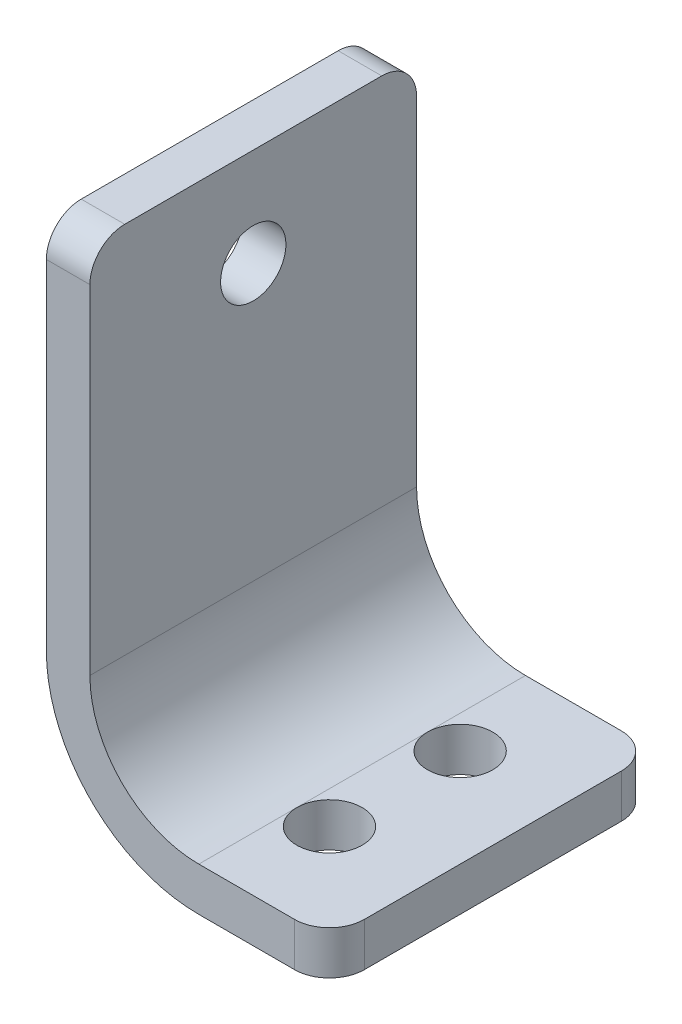
ISO-10303-21;
HEADER;
FILE_DESCRIPTION(('STEP AP214'),'2;1');
FILE_NAME('part.step','',(''),(''),'','','');
FILE_SCHEMA(('AUTOMOTIVE_DESIGN { 1 0 10303 214 1 1 1 1 }'));
ENDSEC;
DATA;
#1=APPLICATION_CONTEXT('core data for automotive mechanical design processes');
#2=APPLICATION_PROTOCOL_DEFINITION('international standard','automotive_design',2000,#1);
#3=PRODUCT_CONTEXT('',#1,'mechanical');
#4=PRODUCT('Part','Part','',(#3));
#5=PRODUCT_RELATED_PRODUCT_CATEGORY('part','',(#4));
#6=PRODUCT_DEFINITION_FORMATION('','',#4);
#7=PRODUCT_DEFINITION_CONTEXT('part definition',#1,'design');
#8=PRODUCT_DEFINITION('design','',#6,#7);
#9=PRODUCT_DEFINITION_SHAPE('','',#8);
#10=(LENGTH_UNIT() NAMED_UNIT(*) SI_UNIT(.MILLI.,.METRE.));
#11=(NAMED_UNIT(*) PLANE_ANGLE_UNIT() SI_UNIT($,.RADIAN.));
#12=(NAMED_UNIT(*) SI_UNIT($,.STERADIAN.) SOLID_ANGLE_UNIT());
#13=UNCERTAINTY_MEASURE_WITH_UNIT(LENGTH_MEASURE(1.E-05),#10,'distance_accuracy_value','');
#14=(GEOMETRIC_REPRESENTATION_CONTEXT(3) GLOBAL_UNCERTAINTY_ASSIGNED_CONTEXT((#13)) GLOBAL_UNIT_ASSIGNED_CONTEXT((#10,
#11,#12)) REPRESENTATION_CONTEXT('',''));
#15=CARTESIAN_POINT('',(0.,0.,0.));
#16=DIRECTION('',(0.,0.,1.));
#17=DIRECTION('',(1.,0.,0.));
#18=AXIS2_PLACEMENT_3D('',#15,#16,#17);
#19=CARTESIAN_POINT('',(0.,19.9954941702119,23.8125));
#20=DIRECTION('',(0.,-1.,0.));
#21=DIRECTION('',(0.,0.,-1.));
#22=AXIS2_PLACEMENT_3D('',#19,#20,#21);
#23=PLANE('',#22);
#24=DIRECTION('',(0.,0.,-1.));
#25=VECTOR('',#24,1.);
#26=CARTESIAN_POINT('',(0.,19.9954941702119,23.8125));
#27=LINE('',#26,#25);
#28=CARTESIAN_POINT('',(0.,19.9954941702119,21.2725));
#29=VERTEX_POINT('',#28);
#30=CARTESIAN_POINT('',(0.,19.9954941702119,2.54));
#31=VERTEX_POINT('',#30);
#32=EDGE_CURVE('E188',#29,#31,#27,.T.);
#33=ORIENTED_EDGE('',*,*,#32,.T.);
#34=DIRECTION('',(-1.,0.,0.));
#35=VECTOR('',#34,1.);
#36=CARTESIAN_POINT('',(-3.175,19.9954941702119,2.54));
#37=LINE('',#36,#35);
#38=CARTESIAN_POINT('',(-3.175,19.9954941702119,2.54));
#39=VERTEX_POINT('',#38);
#40=EDGE_CURVE('E266',#31,#39,#37,.T.);
#41=ORIENTED_EDGE('',*,*,#40,.T.);
#42=DIRECTION('',(0.,0.,-1.));
#43=VECTOR('',#42,1.);
#44=CARTESIAN_POINT('',(-3.175,19.9954941702119,23.8125));
#45=LINE('',#44,#43);
#46=CARTESIAN_POINT('',(-3.175,19.9954941702119,21.2725));
#47=VERTEX_POINT('',#46);
#48=EDGE_CURVE('E165',#47,#39,#45,.T.);
#49=ORIENTED_EDGE('',*,*,#48,.F.);
#50=DIRECTION('',(-1.,0.,0.));
#51=VECTOR('',#50,1.);
#52=CARTESIAN_POINT('',(0.,19.9954941702119,21.2725));
#53=LINE('',#52,#51);
#54=EDGE_CURVE('E60',#47,#29,#53,.F.);
#55=ORIENTED_EDGE('',*,*,#54,.T.);
#56=EDGE_LOOP('',(#33,#41,#49,#55));
#57=FACE_BOUND('',#56,.T.);
#58=ADVANCED_FACE('F39',(#57),#23,.F.);
#59=CARTESIAN_POINT('',(-3.175,19.9954941702119,23.8125));
#60=DIRECTION('',(1.,0.,0.));
#61=DIRECTION('',(0.,1.,0.));
#62=AXIS2_PLACEMENT_3D('',#59,#60,#61);
#63=PLANE('',#62);
#64=CARTESIAN_POINT('',(-3.175,12.8517441702119,11.90625));
#65=DIRECTION('',(1.,0.,0.));
#66=DIRECTION('',(0.,1.,0.));
#67=AXIS2_PLACEMENT_3D('',#64,#65,#66);
#68=CIRCLE('',#67,2.38125);
#69=CARTESIAN_POINT('',(-3.175,15.232994170212,11.90625));
#70=VERTEX_POINT('',#69);
#71=EDGE_CURVE('E192',#70,#70,#68,.T.);
#72=ORIENTED_EDGE('',*,*,#71,.T.);
#73=EDGE_LOOP('',(#72));
#74=FACE_BOUND('',#73,.T.);
#75=ORIENTED_EDGE('',*,*,#48,.T.);
#76=CARTESIAN_POINT('',(-3.175,17.4554941702119,2.54));
#77=DIRECTION('',(1.,0.,0.));
#78=DIRECTION('',(0.,1.,0.));
#79=AXIS2_PLACEMENT_3D('',#76,#77,#78);
#80=CIRCLE('',#79,2.54);
#81=CARTESIAN_POINT('',(-3.175,17.4554941702119,0.));
#82=VERTEX_POINT('',#81);
#83=EDGE_CURVE('E273',#39,#82,#80,.F.);
#84=ORIENTED_EDGE('',*,*,#83,.T.);
#85=DIRECTION('',(0.,-1.,0.));
#86=VECTOR('',#85,1.);
#87=CARTESIAN_POINT('',(-3.175,19.9954941702119,0.));
#88=LINE('',#87,#86);
#89=CARTESIAN_POINT('',(-3.175,-7.21908182978804,0.));
#90=VERTEX_POINT('',#89);
#91=EDGE_CURVE('E160',#82,#90,#88,.T.);
#92=ORIENTED_EDGE('',*,*,#91,.T.);
#93=DIRECTION('',(0.,0.,-1.));
#94=VECTOR('',#93,1.);
#95=CARTESIAN_POINT('',(-3.175,-7.21908182978804,23.8125));
#96=LINE('',#95,#94);
#97=CARTESIAN_POINT('',(-3.175,-7.21908182978804,23.8125));
#98=VERTEX_POINT('',#97);
#99=EDGE_CURVE('E156',#98,#90,#96,.T.);
#100=ORIENTED_EDGE('',*,*,#99,.F.);
#101=DIRECTION('',(0.,-1.,0.));
#102=VECTOR('',#101,1.);
#103=CARTESIAN_POINT('',(-3.175,19.9954941702119,23.8125));
#104=LINE('',#103,#102);
#105=CARTESIAN_POINT('',(-3.175,17.4554941702119,23.8125));
#106=VERTEX_POINT('',#105);
#107=EDGE_CURVE('E141',#106,#98,#104,.T.);
#108=ORIENTED_EDGE('',*,*,#107,.F.);
#109=CARTESIAN_POINT('',(-3.175,17.4554941702119,21.2725));
#110=DIRECTION('',(1.,0.,0.));
#111=DIRECTION('',(0.,1.,0.));
#112=AXIS2_PLACEMENT_3D('',#109,#110,#111);
#113=CIRCLE('',#112,2.54);
#114=EDGE_CURVE('E270',#106,#47,#113,.F.);
#115=ORIENTED_EDGE('',*,*,#114,.T.);
#116=EDGE_LOOP('',(#75,#84,#92,#100,#108,#115));
#117=FACE_BOUND('',#116,.T.);
#118=ADVANCED_FACE('F158',(#74,#117),#63,.F.);
#119=CARTESIAN_POINT('',(7.93749999999999,-7.21908182978804,23.8125));
#120=DIRECTION('',(0.,0.,-1.));
#121=DIRECTION('',(-1.,0.,0.));
#122=AXIS2_PLACEMENT_3D('',#119,#120,#121);
#123=CYLINDRICAL_SURFACE('',#122,11.1125);
#124=CARTESIAN_POINT('',(7.93749999999999,-7.21908182978804,0.));
#125=DIRECTION('',(0.,0.,1.));
#126=DIRECTION('',(-1.,0.,0.));
#127=AXIS2_PLACEMENT_3D('',#124,#125,#126);
#128=CIRCLE('',#127,11.1125);
#129=CARTESIAN_POINT('',(7.93749999999999,-18.331581829788,0.));
#130=VERTEX_POINT('',#129);
#131=EDGE_CURVE('E191',#90,#130,#128,.T.);
#132=ORIENTED_EDGE('',*,*,#131,.T.);
#133=DIRECTION('',(0.,0.,-1.));
#134=VECTOR('',#133,1.);
#135=CARTESIAN_POINT('',(7.93749999999999,-18.331581829788,23.8125));
#136=LINE('',#135,#134);
#137=CARTESIAN_POINT('',(7.93749999999999,-18.331581829788,7.14375));
#138=VERTEX_POINT('',#137);
#139=EDGE_CURVE('E227',#138,#130,#136,.T.);
#140=ORIENTED_EDGE('',*,*,#139,.F.);
#141=CARTESIAN_POINT('',(7.93749999999999,-18.331581829788,16.66875));
#142=VERTEX_POINT('',#141);
#143=EDGE_CURVE('E229',#142,#138,#136,.T.);
#144=ORIENTED_EDGE('',*,*,#143,.F.);
#145=CARTESIAN_POINT('',(7.93749999999999,-18.331581829788,23.8125));
#146=VERTEX_POINT('',#145);
#147=EDGE_CURVE('E166',#146,#142,#136,.T.);
#148=ORIENTED_EDGE('',*,*,#147,.F.);
#149=CARTESIAN_POINT('',(7.93749999999999,-7.21908182978804,23.8125));
#150=DIRECTION('',(0.,0.,1.));
#151=DIRECTION('',(-1.,0.,0.));
#152=AXIS2_PLACEMENT_3D('',#149,#150,#151);
#153=CIRCLE('',#152,11.1125);
#154=EDGE_CURVE('E146',#98,#146,#153,.T.);
#155=ORIENTED_EDGE('',*,*,#154,.F.);
#156=ORIENTED_EDGE('',*,*,#99,.T.);
#157=EDGE_LOOP('',(#132,#140,#144,#148,#155,#156));
#158=FACE_BOUND('',#157,.T.);
#159=ADVANCED_FACE('F168',(#158),#123,.T.);
#160=CARTESIAN_POINT('',(7.93749999999999,-18.331581829788,23.8125));
#161=DIRECTION('',(0.,1.,0.));
#162=DIRECTION('',(-1.,0.,0.));
#163=AXIS2_PLACEMENT_3D('',#160,#161,#162);
#164=PLANE('',#163);
#165=DIRECTION('',(1.,0.,0.));
#166=VECTOR('',#165,1.);
#167=CARTESIAN_POINT('',(7.93749999999999,-18.331581829788,0.));
#168=LINE('',#167,#166);
#169=CARTESIAN_POINT('',(14.9225,-18.331581829788,0.));
#170=VERTEX_POINT('',#169);
#171=EDGE_CURVE('E195',#130,#170,#168,.T.);
#172=ORIENTED_EDGE('',*,*,#171,.T.);
#173=CARTESIAN_POINT('',(14.9225,-18.331581829788,2.54));
#174=DIRECTION('',(0.,1.,0.));
#175=DIRECTION('',(-1.,0.,0.));
#176=AXIS2_PLACEMENT_3D('',#173,#174,#175);
#177=CIRCLE('',#176,2.54);
#178=CARTESIAN_POINT('',(17.4625,-18.331581829788,2.54));
#179=VERTEX_POINT('',#178);
#180=EDGE_CURVE('E255',#170,#179,#177,.F.);
#181=ORIENTED_EDGE('',*,*,#180,.T.);
#182=DIRECTION('',(0.,0.,-1.));
#183=VECTOR('',#182,1.);
#184=CARTESIAN_POINT('',(17.4625,-18.331581829788,23.8125));
#185=LINE('',#184,#183);
#186=CARTESIAN_POINT('',(17.4625,-18.331581829788,21.2725));
#187=VERTEX_POINT('',#186);
#188=EDGE_CURVE('E223',#187,#179,#185,.T.);
#189=ORIENTED_EDGE('',*,*,#188,.F.);
#190=CARTESIAN_POINT('',(14.9225,-18.331581829788,21.2725));
#191=DIRECTION('',(0.,1.,0.));
#192=DIRECTION('',(-1.,0.,0.));
#193=AXIS2_PLACEMENT_3D('',#190,#191,#192);
#194=CIRCLE('',#193,2.54);
#195=CARTESIAN_POINT('',(14.9225,-18.331581829788,23.8125));
#196=VERTEX_POINT('',#195);
#197=EDGE_CURVE('E252',#187,#196,#194,.F.);
#198=ORIENTED_EDGE('',*,*,#197,.T.);
#199=DIRECTION('',(1.,0.,0.));
#200=VECTOR('',#199,1.);
#201=CARTESIAN_POINT('',(7.93749999999999,-18.331581829788,23.8125));
#202=LINE('',#201,#200);
#203=EDGE_CURVE('E173',#146,#196,#202,.T.);
#204=ORIENTED_EDGE('',*,*,#203,.F.);
#205=ORIENTED_EDGE('',*,*,#147,.T.);
#206=CARTESIAN_POINT('',(10.31875,-18.331581829788,16.66875));
#207=DIRECTION('',(0.,1.,0.));
#208=DIRECTION('',(-1.,0.,0.));
#209=AXIS2_PLACEMENT_3D('',#206,#207,#208);
#210=CIRCLE('',#209,2.38125);
#211=EDGE_CURVE('E299',#142,#142,#210,.F.);
#212=ORIENTED_EDGE('',*,*,#211,.F.);
#213=ORIENTED_EDGE('',*,*,#143,.T.);
#214=CARTESIAN_POINT('',(10.31875,-18.331581829788,7.14375));
#215=DIRECTION('',(0.,1.,0.));
#216=DIRECTION('',(-1.,0.,0.));
#217=AXIS2_PLACEMENT_3D('',#214,#215,#216);
#218=CIRCLE('',#217,2.38125);
#219=EDGE_CURVE('E298',#138,#138,#218,.F.);
#220=ORIENTED_EDGE('',*,*,#219,.F.);
#221=ORIENTED_EDGE('',*,*,#139,.T.);
#222=EDGE_LOOP('',(#172,#181,#189,#198,#204,#205,#212,#213,#220,#221));
#223=FACE_BOUND('',#222,.T.);
#224=ADVANCED_FACE('F297',(#223),#164,.F.);
#225=CARTESIAN_POINT('',(17.4625,-15.156581829788,23.8125));
#226=DIRECTION('',(-1.,0.,0.));
#227=DIRECTION('',(0.,0.,1.));
#228=AXIS2_PLACEMENT_3D('',#225,#226,#227);
#229=PLANE('',#228);
#230=ORIENTED_EDGE('',*,*,#188,.T.);
#231=DIRECTION('',(0.,1.,0.));
#232=VECTOR('',#231,1.);
#233=CARTESIAN_POINT('',(17.4625,-15.156581829788,2.54));
#234=LINE('',#233,#232);
#235=CARTESIAN_POINT('',(17.4625,-15.156581829788,2.54));
#236=VERTEX_POINT('',#235);
#237=EDGE_CURVE('E236',#179,#236,#234,.T.);
#238=ORIENTED_EDGE('',*,*,#237,.T.);
#239=DIRECTION('',(0.,0.,-1.));
#240=VECTOR('',#239,1.);
#241=CARTESIAN_POINT('',(17.4625,-15.156581829788,23.8125));
#242=LINE('',#241,#240);
#243=CARTESIAN_POINT('',(17.4625,-15.156581829788,21.2725));
#244=VERTEX_POINT('',#243);
#245=EDGE_CURVE('E218',#244,#236,#242,.T.);
#246=ORIENTED_EDGE('',*,*,#245,.F.);
#247=DIRECTION('',(0.,1.,0.));
#248=VECTOR('',#247,1.);
#249=CARTESIAN_POINT('',(17.4625,-15.156581829788,21.2725));
#250=LINE('',#249,#248);
#251=EDGE_CURVE('E233',#244,#187,#250,.F.);
#252=ORIENTED_EDGE('',*,*,#251,.T.);
#253=EDGE_LOOP('',(#230,#238,#246,#252));
#254=FACE_BOUND('',#253,.T.);
#255=ADVANCED_FACE('F423',(#254),#229,.F.);
#256=CARTESIAN_POINT('',(7.93749999999999,-15.156581829788,23.8125));
#257=DIRECTION('',(0.,-1.,0.));
#258=DIRECTION('',(0.,0.,-1.));
#259=AXIS2_PLACEMENT_3D('',#256,#257,#258);
#260=PLANE('',#259);
#261=ORIENTED_EDGE('',*,*,#245,.T.);
#262=CARTESIAN_POINT('',(14.9225,-15.156581829788,2.54));
#263=DIRECTION('',(0.,-1.,0.));
#264=DIRECTION('',(0.,0.,-1.));
#265=AXIS2_PLACEMENT_3D('',#262,#263,#264);
#266=CIRCLE('',#265,2.54);
#267=CARTESIAN_POINT('',(14.9225,-15.156581829788,0.));
#268=VERTEX_POINT('',#267);
#269=EDGE_CURVE('E243',#236,#268,#266,.F.);
#270=ORIENTED_EDGE('',*,*,#269,.T.);
#271=DIRECTION('',(-1.,0.,0.));
#272=VECTOR('',#271,1.);
#273=CARTESIAN_POINT('',(7.93749999999999,-15.156581829788,0.));
#274=LINE('',#273,#272);
#275=CARTESIAN_POINT('',(7.93749999999999,-15.156581829788,0.));
#276=VERTEX_POINT('',#275);
#277=EDGE_CURVE('E199',#268,#276,#274,.T.);
#278=ORIENTED_EDGE('',*,*,#277,.T.);
#279=DIRECTION('',(0.,0.,-1.));
#280=VECTOR('',#279,1.);
#281=CARTESIAN_POINT('',(7.93749999999999,-15.156581829788,23.8125));
#282=LINE('',#281,#280);
#283=CARTESIAN_POINT('',(7.93749999999999,-15.156581829788,7.14375));
#284=VERTEX_POINT('',#283);
#285=EDGE_CURVE('E213',#284,#276,#282,.T.);
#286=ORIENTED_EDGE('',*,*,#285,.F.);
#287=CARTESIAN_POINT('',(10.31875,-15.156581829788,7.14375));
#288=DIRECTION('',(0.,1.,0.));
#289=DIRECTION('',(0.,0.,1.));
#290=AXIS2_PLACEMENT_3D('',#287,#288,#289);
#291=CIRCLE('',#290,2.38125);
#292=EDGE_CURVE('E322',#284,#284,#291,.T.);
#293=ORIENTED_EDGE('',*,*,#292,.F.);
#294=CARTESIAN_POINT('',(7.93749999999999,-15.156581829788,16.66875));
#295=VERTEX_POINT('',#294);
#296=EDGE_CURVE('E219',#295,#284,#282,.T.);
#297=ORIENTED_EDGE('',*,*,#296,.F.);
#298=CARTESIAN_POINT('',(10.31875,-15.156581829788,16.66875));
#299=DIRECTION('',(0.,1.,0.));
#300=DIRECTION('',(0.,0.,1.));
#301=AXIS2_PLACEMENT_3D('',#298,#299,#300);
#302=CIRCLE('',#301,2.38125);
#303=EDGE_CURVE('E317',#295,#295,#302,.T.);
#304=ORIENTED_EDGE('',*,*,#303,.F.);
#305=CARTESIAN_POINT('',(7.93749999999999,-15.156581829788,23.8125));
#306=VERTEX_POINT('',#305);
#307=EDGE_CURVE('E214',#306,#295,#282,.T.);
#308=ORIENTED_EDGE('',*,*,#307,.F.);
#309=DIRECTION('',(-1.,0.,0.));
#310=VECTOR('',#309,1.);
#311=CARTESIAN_POINT('',(7.93749999999999,-15.156581829788,23.8125));
#312=LINE('',#311,#310);
#313=CARTESIAN_POINT('',(14.9225,-15.156581829788,23.8125));
#314=VERTEX_POINT('',#313);
#315=EDGE_CURVE('E176',#314,#306,#312,.T.);
#316=ORIENTED_EDGE('',*,*,#315,.F.);
#317=CARTESIAN_POINT('',(14.9225,-15.156581829788,21.2725));
#318=DIRECTION('',(0.,-1.,0.));
#319=DIRECTION('',(0.,0.,-1.));
#320=AXIS2_PLACEMENT_3D('',#317,#318,#319);
#321=CIRCLE('',#320,2.54);
#322=EDGE_CURVE('E240',#314,#244,#321,.F.);
#323=ORIENTED_EDGE('',*,*,#322,.T.);
#324=EDGE_LOOP('',(#261,#270,#278,#286,#293,#297,#304,#308,#316,#323));
#325=FACE_BOUND('',#324,.T.);
#326=ADVANCED_FACE('F316',(#325),#260,.F.);
#327=CARTESIAN_POINT('',(7.93749999999999,-7.21908182978804,23.8125));
#328=DIRECTION('',(0.,0.,-1.));
#329=DIRECTION('',(-1.,0.,0.));
#330=AXIS2_PLACEMENT_3D('',#327,#328,#329);
#331=CYLINDRICAL_SURFACE('',#330,7.9375);
#332=CARTESIAN_POINT('',(7.93749999999999,-7.21908182978804,0.));
#333=DIRECTION('',(0.,0.,-1.));
#334=DIRECTION('',(-1.,0.,0.));
#335=AXIS2_PLACEMENT_3D('',#332,#333,#334);
#336=CIRCLE('',#335,7.9375);
#337=CARTESIAN_POINT('',(0.,-7.21908182978804,0.));
#338=VERTEX_POINT('',#337);
#339=EDGE_CURVE('E202',#276,#338,#336,.T.);
#340=ORIENTED_EDGE('',*,*,#339,.T.);
#341=DIRECTION('',(0.,0.,-1.));
#342=VECTOR('',#341,1.);
#343=CARTESIAN_POINT('',(0.,-7.21908182978804,23.8125));
#344=LINE('',#343,#342);
#345=CARTESIAN_POINT('',(0.,-7.21908182978804,23.8125));
#346=VERTEX_POINT('',#345);
#347=EDGE_CURVE('E209',#346,#338,#344,.T.);
#348=ORIENTED_EDGE('',*,*,#347,.F.);
#349=CARTESIAN_POINT('',(7.93749999999999,-7.21908182978804,23.8125));
#350=DIRECTION('',(0.,0.,-1.));
#351=DIRECTION('',(-1.,0.,0.));
#352=AXIS2_PLACEMENT_3D('',#349,#350,#351);
#353=CIRCLE('',#352,7.9375);
#354=EDGE_CURVE('E182',#306,#346,#353,.T.);
#355=ORIENTED_EDGE('',*,*,#354,.F.);
#356=ORIENTED_EDGE('',*,*,#307,.T.);
#357=ORIENTED_EDGE('',*,*,#296,.T.);
#358=ORIENTED_EDGE('',*,*,#285,.T.);
#359=EDGE_LOOP('',(#340,#348,#355,#356,#357,#358));
#360=FACE_BOUND('',#359,.T.);
#361=ADVANCED_FACE('F308',(#360),#331,.F.);
#362=CARTESIAN_POINT('',(0.,19.9954941702119,23.8125));
#363=DIRECTION('',(-1.,0.,0.));
#364=DIRECTION('',(0.,-1.,0.));
#365=AXIS2_PLACEMENT_3D('',#362,#363,#364);
#366=PLANE('',#365);
#367=CARTESIAN_POINT('',(0.,12.8517441702119,11.90625));
#368=DIRECTION('',(-1.,0.,0.));
#369=DIRECTION('',(0.,-1.,0.));
#370=AXIS2_PLACEMENT_3D('',#367,#368,#369);
#371=CIRCLE('',#370,2.38125);
#372=CARTESIAN_POINT('',(0.,10.4704941702119,11.90625));
#373=VERTEX_POINT('',#372);
#374=EDGE_CURVE('E329',#373,#373,#371,.T.);
#375=ORIENTED_EDGE('',*,*,#374,.T.);
#376=EDGE_LOOP('',(#375));
#377=FACE_BOUND('',#376,.T.);
#378=DIRECTION('',(0.,1.,0.));
#379=VECTOR('',#378,1.);
#380=CARTESIAN_POINT('',(0.,19.9954941702119,0.));
#381=LINE('',#380,#379);
#382=CARTESIAN_POINT('',(0.,17.4554941702119,0.));
#383=VERTEX_POINT('',#382);
#384=EDGE_CURVE('E153',#338,#383,#381,.T.);
#385=ORIENTED_EDGE('',*,*,#384,.T.);
#386=CARTESIAN_POINT('',(0.,17.4554941702119,2.54));
#387=DIRECTION('',(-1.,0.,0.));
#388=DIRECTION('',(0.,-1.,0.));
#389=AXIS2_PLACEMENT_3D('',#386,#387,#388);
#390=CIRCLE('',#389,2.54);
#391=EDGE_CURVE('E11',#383,#31,#390,.F.);
#392=ORIENTED_EDGE('',*,*,#391,.T.);
#393=ORIENTED_EDGE('',*,*,#32,.F.);
#394=CARTESIAN_POINT('',(0.,17.4554941702119,21.2725));
#395=DIRECTION('',(-1.,0.,0.));
#396=DIRECTION('',(0.,-1.,0.));
#397=AXIS2_PLACEMENT_3D('',#394,#395,#396);
#398=CIRCLE('',#397,2.54);
#399=CARTESIAN_POINT('',(0.,17.4554941702119,23.8125));
#400=VERTEX_POINT('',#399);
#401=EDGE_CURVE('E48',#29,#400,#398,.F.);
#402=ORIENTED_EDGE('',*,*,#401,.T.);
#403=DIRECTION('',(0.,1.,0.));
#404=VECTOR('',#403,1.);
#405=CARTESIAN_POINT('',(0.,19.9954941702119,23.8125));
#406=LINE('',#405,#404);
#407=EDGE_CURVE('E185',#346,#400,#406,.T.);
#408=ORIENTED_EDGE('',*,*,#407,.F.);
#409=ORIENTED_EDGE('',*,*,#347,.T.);
#410=EDGE_LOOP('',(#385,#392,#393,#402,#408,#409));
#411=FACE_BOUND('',#410,.T.);
#412=ADVANCED_FACE('F278',(#377,#411),#366,.F.);
#413=CARTESIAN_POINT('',(7.93749999999999,-7.21908182978804,23.8125));
#414=DIRECTION('',(0.,0.,-1.));
#415=DIRECTION('',(-1.,0.,0.));
#416=AXIS2_PLACEMENT_3D('',#413,#414,#415);
#417=PLANE('',#416);
#418=ORIENTED_EDGE('',*,*,#203,.T.);
#419=DIRECTION('',(0.,1.,0.));
#420=VECTOR('',#419,1.);
#421=CARTESIAN_POINT('',(14.9225,-7.21908182978804,23.8125));
#422=LINE('',#421,#420);
#423=EDGE_CURVE('E260',#196,#314,#422,.T.);
#424=ORIENTED_EDGE('',*,*,#423,.T.);
#425=ORIENTED_EDGE('',*,*,#315,.T.);
#426=ORIENTED_EDGE('',*,*,#354,.T.);
#427=ORIENTED_EDGE('',*,*,#407,.T.);
#428=DIRECTION('',(-1.,0.,0.));
#429=VECTOR('',#428,1.);
#430=CARTESIAN_POINT('',(7.93749999999999,17.4554941702119,23.8125));
#431=LINE('',#430,#429);
#432=EDGE_CURVE('E150',#400,#106,#431,.T.);
#433=ORIENTED_EDGE('',*,*,#432,.T.);
#434=ORIENTED_EDGE('',*,*,#107,.T.);
#435=ORIENTED_EDGE('',*,*,#154,.T.);
#436=EDGE_LOOP('',(#418,#424,#425,#426,#427,#433,#434,#435));
#437=FACE_BOUND('',#436,.T.);
#438=ADVANCED_FACE('F144',(#437),#417,.F.);
#439=CARTESIAN_POINT('',(7.93749999999999,-7.21908182978804,0.));
#440=DIRECTION('',(0.,0.,-1.));
#441=DIRECTION('',(-1.,0.,0.));
#442=AXIS2_PLACEMENT_3D('',#439,#440,#441);
#443=PLANE('',#442);
#444=ORIENTED_EDGE('',*,*,#277,.F.);
#445=DIRECTION('',(0.,1.,0.));
#446=VECTOR('',#445,1.);
#447=CARTESIAN_POINT('',(14.9225,-18.331581829788,0.));
#448=LINE('',#447,#446);
#449=EDGE_CURVE('E249',#268,#170,#448,.F.);
#450=ORIENTED_EDGE('',*,*,#449,.T.);
#451=ORIENTED_EDGE('',*,*,#171,.F.);
#452=ORIENTED_EDGE('',*,*,#131,.F.);
#453=ORIENTED_EDGE('',*,*,#91,.F.);
#454=DIRECTION('',(-1.,0.,0.));
#455=VECTOR('',#454,1.);
#456=CARTESIAN_POINT('',(0.,17.4554941702119,0.));
#457=LINE('',#456,#455);
#458=EDGE_CURVE('E246',#82,#383,#457,.F.);
#459=ORIENTED_EDGE('',*,*,#458,.T.);
#460=ORIENTED_EDGE('',*,*,#384,.F.);
#461=ORIENTED_EDGE('',*,*,#339,.F.);
#462=EDGE_LOOP('',(#444,#450,#451,#452,#453,#459,#460,#461));
#463=FACE_BOUND('',#462,.T.);
#464=ADVANCED_FACE('F288',(#463),#443,.T.);
#465=CARTESIAN_POINT('',(17.4635,12.851744170212,11.90625));
#466=DIRECTION('',(-1.,0.,0.));
#467=DIRECTION('',(0.,-1.,0.));
#468=AXIS2_PLACEMENT_3D('',#465,#466,#467);
#469=CYLINDRICAL_SURFACE('',#468,2.38125);
#470=ORIENTED_EDGE('',*,*,#71,.F.);
#471=EDGE_LOOP('',(#470));
#472=FACE_BOUND('',#471,.T.);
#473=ORIENTED_EDGE('',*,*,#374,.F.);
#474=EDGE_LOOP('',(#473));
#475=FACE_BOUND('',#474,.T.);
#476=ADVANCED_FACE('F350',(#472,#475),#469,.F.);
#477=CARTESIAN_POINT('',(10.31875,-18.332581829788,16.66875));
#478=DIRECTION('',(0.,1.,0.));
#479=DIRECTION('',(0.,0.,1.));
#480=AXIS2_PLACEMENT_3D('',#477,#478,#479);
#481=CYLINDRICAL_SURFACE('',#480,2.38125);
#482=ORIENTED_EDGE('',*,*,#303,.T.);
#483=EDGE_LOOP('',(#482));
#484=FACE_BOUND('',#483,.T.);
#485=ORIENTED_EDGE('',*,*,#211,.T.);
#486=EDGE_LOOP('',(#485));
#487=FACE_BOUND('',#486,.T.);
#488=ADVANCED_FACE('F341',(#484,#487),#481,.F.);
#489=CARTESIAN_POINT('',(10.31875,-18.332581829788,7.14375));
#490=DIRECTION('',(0.,1.,0.));
#491=DIRECTION('',(0.,0.,1.));
#492=AXIS2_PLACEMENT_3D('',#489,#490,#491);
#493=CYLINDRICAL_SURFACE('',#492,2.38125);
#494=ORIENTED_EDGE('',*,*,#292,.T.);
#495=EDGE_LOOP('',(#494));
#496=FACE_BOUND('',#495,.T.);
#497=ORIENTED_EDGE('',*,*,#219,.T.);
#498=EDGE_LOOP('',(#497));
#499=FACE_BOUND('',#498,.T.);
#500=ADVANCED_FACE('F338',(#496,#499),#493,.F.);
#501=CARTESIAN_POINT('',(14.9225,-15.156581829788,2.54));
#502=DIRECTION('',(0.,-1.,0.));
#503=DIRECTION('',(0.,0.,-1.));
#504=AXIS2_PLACEMENT_3D('',#501,#502,#503);
#505=CYLINDRICAL_SURFACE('',#504,2.54);
#506=ORIENTED_EDGE('',*,*,#180,.F.);
#507=ORIENTED_EDGE('',*,*,#449,.F.);
#508=ORIENTED_EDGE('',*,*,#269,.F.);
#509=ORIENTED_EDGE('',*,*,#237,.F.);
#510=EDGE_LOOP('',(#506,#507,#508,#509));
#511=FACE_BOUND('',#510,.T.);
#512=ADVANCED_FACE('F340',(#511),#505,.T.);
#513=CARTESIAN_POINT('',(14.9225,-7.21908182978804,21.2725));
#514=DIRECTION('',(0.,1.,0.));
#515=DIRECTION('',(0.,0.,1.));
#516=AXIS2_PLACEMENT_3D('',#513,#514,#515);
#517=CYLINDRICAL_SURFACE('',#516,2.54);
#518=ORIENTED_EDGE('',*,*,#197,.F.);
#519=ORIENTED_EDGE('',*,*,#251,.F.);
#520=ORIENTED_EDGE('',*,*,#322,.F.);
#521=ORIENTED_EDGE('',*,*,#423,.F.);
#522=EDGE_LOOP('',(#518,#519,#520,#521));
#523=FACE_BOUND('',#522,.T.);
#524=ADVANCED_FACE('F347',(#523),#517,.T.);
#525=CARTESIAN_POINT('',(0.,17.4554941702119,2.54));
#526=DIRECTION('',(1.,0.,0.));
#527=DIRECTION('',(0.,0.,-1.));
#528=AXIS2_PLACEMENT_3D('',#525,#526,#527);
#529=CYLINDRICAL_SURFACE('',#528,2.54);
#530=ORIENTED_EDGE('',*,*,#391,.F.);
#531=ORIENTED_EDGE('',*,*,#458,.F.);
#532=ORIENTED_EDGE('',*,*,#83,.F.);
#533=ORIENTED_EDGE('',*,*,#40,.F.);
#534=EDGE_LOOP('',(#530,#531,#532,#533));
#535=FACE_BOUND('',#534,.T.);
#536=ADVANCED_FACE('F284',(#535),#529,.T.);
#537=CARTESIAN_POINT('',(7.93749999999999,17.4554941702119,21.2725));
#538=DIRECTION('',(-1.,0.,0.));
#539=DIRECTION('',(0.,0.,1.));
#540=AXIS2_PLACEMENT_3D('',#537,#538,#539);
#541=CYLINDRICAL_SURFACE('',#540,2.54);
#542=ORIENTED_EDGE('',*,*,#401,.F.);
#543=ORIENTED_EDGE('',*,*,#54,.F.);
#544=ORIENTED_EDGE('',*,*,#114,.F.);
#545=ORIENTED_EDGE('',*,*,#432,.F.);
#546=EDGE_LOOP('',(#542,#543,#544,#545));
#547=FACE_BOUND('',#546,.T.);
#548=ADVANCED_FACE('F41',(#547),#541,.T.);
#549=CLOSED_SHELL('',(#58,#118,#159,#224,#255,#326,#361,#412,#438,#464,#476,#488,#500,#512,#524,
#536,#548));
#550=MANIFOLD_SOLID_BREP('B2',#549);
#551=ADVANCED_BREP_SHAPE_REPRESENTATION('',(#18,#550),#14);
#552=SHAPE_DEFINITION_REPRESENTATION(#9,#551);
ENDSEC;
END-ISO-10303-21;
